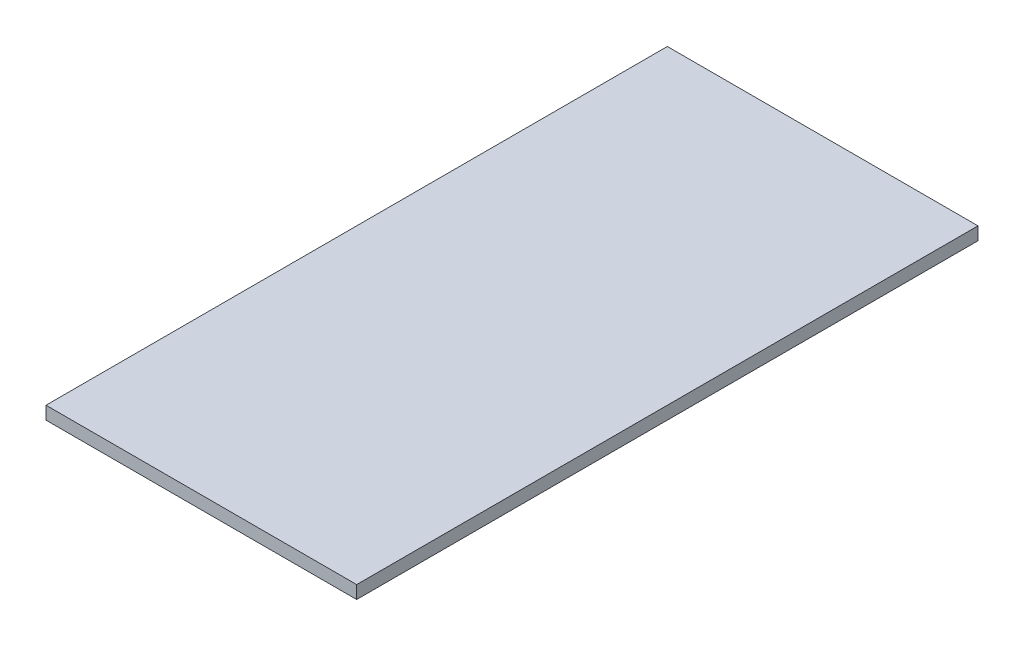
ISO-10303-21;
HEADER;
FILE_DESCRIPTION(('STEP AP214'),'2;1');
FILE_NAME('part.step','',(''),(''),'','','');
FILE_SCHEMA(('AUTOMOTIVE_DESIGN { 1 0 10303 214 1 1 1 1 }'));
ENDSEC;
DATA;
#1=APPLICATION_CONTEXT('core data for automotive mechanical design processes');
#2=APPLICATION_PROTOCOL_DEFINITION('international standard','automotive_design',2000,#1);
#3=PRODUCT_CONTEXT('',#1,'mechanical');
#4=PRODUCT('Part','Part','',(#3));
#5=PRODUCT_RELATED_PRODUCT_CATEGORY('part','',(#4));
#6=PRODUCT_DEFINITION_FORMATION('','',#4);
#7=PRODUCT_DEFINITION_CONTEXT('part definition',#1,'design');
#8=PRODUCT_DEFINITION('design','',#6,#7);
#9=PRODUCT_DEFINITION_SHAPE('','',#8);
#10=(LENGTH_UNIT() NAMED_UNIT(*) SI_UNIT(.MILLI.,.METRE.));
#11=(NAMED_UNIT(*) PLANE_ANGLE_UNIT() SI_UNIT($,.RADIAN.));
#12=(NAMED_UNIT(*) SI_UNIT($,.STERADIAN.) SOLID_ANGLE_UNIT());
#13=UNCERTAINTY_MEASURE_WITH_UNIT(LENGTH_MEASURE(1.E-05),#10,'distance_accuracy_value','');
#14=(GEOMETRIC_REPRESENTATION_CONTEXT(3) GLOBAL_UNCERTAINTY_ASSIGNED_CONTEXT((#13)) GLOBAL_UNIT_ASSIGNED_CONTEXT((#10,
#11,#12)) REPRESENTATION_CONTEXT('',''));
#15=CARTESIAN_POINT('',(0.,0.,0.));
#16=DIRECTION('',(0.,0.,1.));
#17=DIRECTION('',(1.,0.,0.));
#18=AXIS2_PLACEMENT_3D('',#15,#16,#17);
#19=CARTESIAN_POINT('',(38.1,3.175,76.2));
#20=DIRECTION('',(-1.,0.,0.));
#21=DIRECTION('',(0.,0.,1.));
#22=AXIS2_PLACEMENT_3D('',#19,#20,#21);
#23=PLANE('',#22);
#24=DIRECTION('',(0.,0.,-1.));
#25=VECTOR('',#24,1.);
#26=CARTESIAN_POINT('',(38.1,0.,76.2));
#27=LINE('',#26,#25);
#28=CARTESIAN_POINT('',(38.1,0.,76.2));
#29=VERTEX_POINT('',#28);
#30=CARTESIAN_POINT('',(38.1,0.,-76.2));
#31=VERTEX_POINT('',#30);
#32=EDGE_CURVE('E103',#29,#31,#27,.T.);
#33=ORIENTED_EDGE('',*,*,#32,.T.);
#34=DIRECTION('',(0.,-1.,0.));
#35=VECTOR('',#34,1.);
#36=CARTESIAN_POINT('',(38.1,3.175,-76.2));
#37=LINE('',#36,#35);
#38=CARTESIAN_POINT('',(38.1,3.175,-76.2));
#39=VERTEX_POINT('',#38);
#40=EDGE_CURVE('E11',#39,#31,#37,.T.);
#41=ORIENTED_EDGE('',*,*,#40,.F.);
#42=DIRECTION('',(0.,0.,-1.));
#43=VECTOR('',#42,1.);
#44=CARTESIAN_POINT('',(38.1,3.175,76.2));
#45=LINE('',#44,#43);
#46=CARTESIAN_POINT('',(38.1,3.175,76.2));
#47=VERTEX_POINT('',#46);
#48=EDGE_CURVE('E90',#47,#39,#45,.T.);
#49=ORIENTED_EDGE('',*,*,#48,.F.);
#50=DIRECTION('',(0.,-1.,0.));
#51=VECTOR('',#50,1.);
#52=CARTESIAN_POINT('',(38.1,3.175,76.2));
#53=LINE('',#52,#51);
#54=EDGE_CURVE('E99',#47,#29,#53,.T.);
#55=ORIENTED_EDGE('',*,*,#54,.T.);
#56=EDGE_LOOP('',(#33,#41,#49,#55));
#57=FACE_BOUND('',#56,.T.);
#58=ADVANCED_FACE('F38',(#57),#23,.F.);
#59=CARTESIAN_POINT('',(-38.1,3.175,-76.2));
#60=DIRECTION('',(0.,0.,1.));
#61=DIRECTION('',(1.,0.,0.));
#62=AXIS2_PLACEMENT_3D('',#59,#60,#61);
#63=PLANE('',#62);
#64=DIRECTION('',(-1.,0.,0.));
#65=VECTOR('',#64,1.);
#66=CARTESIAN_POINT('',(-38.1,0.,-76.2));
#67=LINE('',#66,#65);
#68=CARTESIAN_POINT('',(-38.1,0.,-76.2));
#69=VERTEX_POINT('',#68);
#70=EDGE_CURVE('E94',#31,#69,#67,.T.);
#71=ORIENTED_EDGE('',*,*,#70,.T.);
#72=DIRECTION('',(0.,-1.,0.));
#73=VECTOR('',#72,1.);
#74=CARTESIAN_POINT('',(-38.1,3.175,-76.2));
#75=LINE('',#74,#73);
#76=CARTESIAN_POINT('',(-38.1,3.175,-76.2));
#77=VERTEX_POINT('',#76);
#78=EDGE_CURVE('E46',#77,#69,#75,.T.);
#79=ORIENTED_EDGE('',*,*,#78,.F.);
#80=DIRECTION('',(-1.,0.,0.));
#81=VECTOR('',#80,1.);
#82=CARTESIAN_POINT('',(-38.1,3.175,-76.2));
#83=LINE('',#82,#81);
#84=EDGE_CURVE('E85',#39,#77,#83,.T.);
#85=ORIENTED_EDGE('',*,*,#84,.F.);
#86=ORIENTED_EDGE('',*,*,#40,.T.);
#87=EDGE_LOOP('',(#71,#79,#85,#86));
#88=FACE_BOUND('',#87,.T.);
#89=ADVANCED_FACE('F93',(#88),#63,.F.);
#90=CARTESIAN_POINT('',(-38.1,3.175,76.2));
#91=DIRECTION('',(1.,0.,0.));
#92=DIRECTION('',(0.,0.,-1.));
#93=AXIS2_PLACEMENT_3D('',#90,#91,#92);
#94=PLANE('',#93);
#95=DIRECTION('',(0.,0.,1.));
#96=VECTOR('',#95,1.);
#97=CARTESIAN_POINT('',(-38.1,0.,76.2));
#98=LINE('',#97,#96);
#99=CARTESIAN_POINT('',(-38.1,0.,76.2));
#100=VERTEX_POINT('',#99);
#101=EDGE_CURVE('E72',#69,#100,#98,.T.);
#102=ORIENTED_EDGE('',*,*,#101,.T.);
#103=DIRECTION('',(0.,-1.,0.));
#104=VECTOR('',#103,1.);
#105=CARTESIAN_POINT('',(-38.1,3.175,76.2));
#106=LINE('',#105,#104);
#107=CARTESIAN_POINT('',(-38.1,3.175,76.2));
#108=VERTEX_POINT('',#107);
#109=EDGE_CURVE('E95',#108,#100,#106,.T.);
#110=ORIENTED_EDGE('',*,*,#109,.F.);
#111=DIRECTION('',(0.,0.,1.));
#112=VECTOR('',#111,1.);
#113=CARTESIAN_POINT('',(-38.1,3.175,76.2));
#114=LINE('',#113,#112);
#115=EDGE_CURVE('E88',#77,#108,#114,.T.);
#116=ORIENTED_EDGE('',*,*,#115,.F.);
#117=ORIENTED_EDGE('',*,*,#78,.T.);
#118=EDGE_LOOP('',(#102,#110,#116,#117));
#119=FACE_BOUND('',#118,.T.);
#120=ADVANCED_FACE('F96',(#119),#94,.F.);
#121=CARTESIAN_POINT('',(-38.1,3.175,76.2));
#122=DIRECTION('',(0.,0.,-1.));
#123=DIRECTION('',(-1.,0.,0.));
#124=AXIS2_PLACEMENT_3D('',#121,#122,#123);
#125=PLANE('',#124);
#126=DIRECTION('',(1.,0.,0.));
#127=VECTOR('',#126,1.);
#128=CARTESIAN_POINT('',(-38.1,0.,76.2));
#129=LINE('',#128,#127);
#130=EDGE_CURVE('E78',#100,#29,#129,.T.);
#131=ORIENTED_EDGE('',*,*,#130,.T.);
#132=ORIENTED_EDGE('',*,*,#54,.F.);
#133=DIRECTION('',(1.,0.,0.));
#134=VECTOR('',#133,1.);
#135=CARTESIAN_POINT('',(-38.1,3.175,76.2));
#136=LINE('',#135,#134);
#137=EDGE_CURVE('E55',#108,#47,#136,.T.);
#138=ORIENTED_EDGE('',*,*,#137,.F.);
#139=ORIENTED_EDGE('',*,*,#109,.T.);
#140=EDGE_LOOP('',(#131,#132,#138,#139));
#141=FACE_BOUND('',#140,.T.);
#142=ADVANCED_FACE('F111',(#141),#125,.F.);
#143=CARTESIAN_POINT('',(0.,3.175,0.));
#144=DIRECTION('',(0.,-1.,0.));
#145=DIRECTION('',(0.,0.,-1.));
#146=AXIS2_PLACEMENT_3D('',#143,#144,#145);
#147=PLANE('',#146);
#148=ORIENTED_EDGE('',*,*,#48,.T.);
#149=ORIENTED_EDGE('',*,*,#84,.T.);
#150=ORIENTED_EDGE('',*,*,#115,.T.);
#151=ORIENTED_EDGE('',*,*,#137,.T.);
#152=EDGE_LOOP('',(#148,#149,#150,#151));
#153=FACE_BOUND('',#152,.T.);
#154=ADVANCED_FACE('F86',(#153),#147,.F.);
#155=CARTESIAN_POINT('',(0.,0.,0.));
#156=DIRECTION('',(0.,-1.,0.));
#157=DIRECTION('',(0.,0.,-1.));
#158=AXIS2_PLACEMENT_3D('',#155,#156,#157);
#159=PLANE('',#158);
#160=ORIENTED_EDGE('',*,*,#32,.F.);
#161=ORIENTED_EDGE('',*,*,#130,.F.);
#162=ORIENTED_EDGE('',*,*,#101,.F.);
#163=ORIENTED_EDGE('',*,*,#70,.F.);
#164=EDGE_LOOP('',(#160,#161,#162,#163));
#165=FACE_BOUND('',#164,.T.);
#166=ADVANCED_FACE('F114',(#165),#159,.T.);
#167=CLOSED_SHELL('',(#58,#89,#120,#142,#154,#166));
#168=MANIFOLD_SOLID_BREP('B2',#167);
#169=ADVANCED_BREP_SHAPE_REPRESENTATION('',(#18,#168),#14);
#170=SHAPE_DEFINITION_REPRESENTATION(#9,#169);
ENDSEC;
END-ISO-10303-21;
